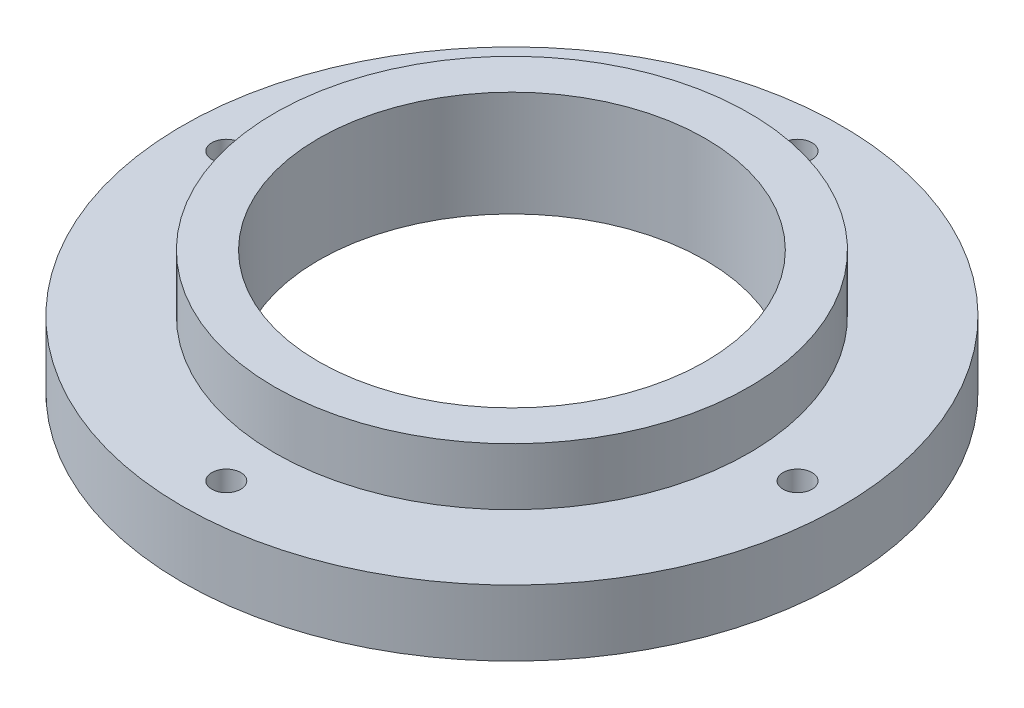
ISO-10303-21;
HEADER;
FILE_DESCRIPTION(('STEP AP214'),'2;1');
FILE_NAME('part.step','',(''),(''),'','','');
FILE_SCHEMA(('AUTOMOTIVE_DESIGN { 1 0 10303 214 1 1 1 1 }'));
ENDSEC;
DATA;
#1=APPLICATION_CONTEXT('core data for automotive mechanical design processes');
#2=APPLICATION_PROTOCOL_DEFINITION('international standard','automotive_design',2000,#1);
#3=PRODUCT_CONTEXT('',#1,'mechanical');
#4=PRODUCT('Part','Part','',(#3));
#5=PRODUCT_RELATED_PRODUCT_CATEGORY('part','',(#4));
#6=PRODUCT_DEFINITION_FORMATION('','',#4);
#7=PRODUCT_DEFINITION_CONTEXT('part definition',#1,'design');
#8=PRODUCT_DEFINITION('design','',#6,#7);
#9=PRODUCT_DEFINITION_SHAPE('','',#8);
#10=(LENGTH_UNIT() NAMED_UNIT(*) SI_UNIT(.MILLI.,.METRE.));
#11=(NAMED_UNIT(*) PLANE_ANGLE_UNIT() SI_UNIT($,.RADIAN.));
#12=(NAMED_UNIT(*) SI_UNIT($,.STERADIAN.) SOLID_ANGLE_UNIT());
#13=UNCERTAINTY_MEASURE_WITH_UNIT(LENGTH_MEASURE(1.E-05),#10,'distance_accuracy_value','');
#14=(GEOMETRIC_REPRESENTATION_CONTEXT(3) GLOBAL_UNCERTAINTY_ASSIGNED_CONTEXT((#13)) GLOBAL_UNIT_ASSIGNED_CONTEXT((#10,
#11,#12)) REPRESENTATION_CONTEXT('',''));
#15=CARTESIAN_POINT('',(0.,0.,0.));
#16=DIRECTION('',(0.,0.,1.));
#17=DIRECTION('',(1.,0.,0.));
#18=AXIS2_PLACEMENT_3D('',#15,#16,#17);
#19=CARTESIAN_POINT('',(0.,14.,0.));
#20=DIRECTION('',(0.,-1.,0.));
#21=DIRECTION('',(0.,0.,-1.));
#22=AXIS2_PLACEMENT_3D('',#19,#20,#21);
#23=CYLINDRICAL_SURFACE('',#22,22.);
#24=CARTESIAN_POINT('',(0.,14.,0.));
#25=DIRECTION('',(0.,1.,0.));
#26=DIRECTION('',(0.,0.,1.));
#27=AXIS2_PLACEMENT_3D('',#24,#25,#26);
#28=CIRCLE('',#27,22.);
#29=CARTESIAN_POINT('',(0.,14.,22.));
#30=VERTEX_POINT('',#29);
#31=EDGE_CURVE('E51',#30,#30,#28,.T.);
#32=ORIENTED_EDGE('',*,*,#31,.T.);
#33=EDGE_LOOP('',(#32));
#34=FACE_BOUND('',#33,.T.);
#35=CARTESIAN_POINT('',(0.,2.,0.));
#36=DIRECTION('',(0.,-1.,0.));
#37=DIRECTION('',(0.,0.,-1.));
#38=AXIS2_PLACEMENT_3D('',#35,#36,#37);
#39=CIRCLE('',#38,22.);
#40=CARTESIAN_POINT('',(0.,2.,-22.));
#41=VERTEX_POINT('',#40);
#42=EDGE_CURVE('E47',#41,#41,#39,.T.);
#43=ORIENTED_EDGE('',*,*,#42,.T.);
#44=EDGE_LOOP('',(#43));
#45=FACE_BOUND('',#44,.T.);
#46=ADVANCED_FACE('F43',(#34,#45),#23,.F.);
#47=CARTESIAN_POINT('',(0.,14.,0.));
#48=DIRECTION('',(0.,1.,0.));
#49=DIRECTION('',(0.,0.,1.));
#50=AXIS2_PLACEMENT_3D('',#47,#48,#49);
#51=PLANE('',#50);
#52=ORIENTED_EDGE('',*,*,#31,.F.);
#53=EDGE_LOOP('',(#52));
#54=FACE_BOUND('',#53,.T.);
#55=CARTESIAN_POINT('',(0.,14.,0.));
#56=DIRECTION('',(0.,1.,0.));
#57=DIRECTION('',(0.,0.,1.));
#58=AXIS2_PLACEMENT_3D('',#55,#56,#57);
#59=CIRCLE('',#58,27.);
#60=CARTESIAN_POINT('',(0.,14.,27.));
#61=VERTEX_POINT('',#60);
#62=EDGE_CURVE('E61',#61,#61,#59,.T.);
#63=ORIENTED_EDGE('',*,*,#62,.T.);
#64=EDGE_LOOP('',(#63));
#65=FACE_BOUND('',#64,.T.);
#66=ADVANCED_FACE('F112',(#54,#65),#51,.T.);
#67=CARTESIAN_POINT('',(0.,14.,0.));
#68=DIRECTION('',(0.,-1.,0.));
#69=DIRECTION('',(0.,0.,-1.));
#70=AXIS2_PLACEMENT_3D('',#67,#68,#69);
#71=CYLINDRICAL_SURFACE('',#70,37.5);
#72=CARTESIAN_POINT('',(0.,0.,0.));
#73=DIRECTION('',(0.,1.,0.));
#74=DIRECTION('',(0.,0.,1.));
#75=AXIS2_PLACEMENT_3D('',#72,#73,#74);
#76=CIRCLE('',#75,37.5);
#77=CARTESIAN_POINT('',(0.,0.,37.5));
#78=VERTEX_POINT('',#77);
#79=EDGE_CURVE('E10',#78,#78,#76,.T.);
#80=ORIENTED_EDGE('',*,*,#79,.T.);
#81=EDGE_LOOP('',(#80));
#82=FACE_BOUND('',#81,.T.);
#83=CARTESIAN_POINT('',(0.,7.5,0.));
#84=DIRECTION('',(0.,1.,0.));
#85=DIRECTION('',(0.,0.,1.));
#86=AXIS2_PLACEMENT_3D('',#83,#84,#85);
#87=CIRCLE('',#86,37.5);
#88=CARTESIAN_POINT('',(0.,7.5,37.5));
#89=VERTEX_POINT('',#88);
#90=EDGE_CURVE('E55',#89,#89,#87,.T.);
#91=ORIENTED_EDGE('',*,*,#90,.F.);
#92=EDGE_LOOP('',(#91));
#93=FACE_BOUND('',#92,.T.);
#94=ADVANCED_FACE('F45',(#82,#93),#71,.T.);
#95=CARTESIAN_POINT('',(0.,0.,0.));
#96=DIRECTION('',(0.,1.,0.));
#97=DIRECTION('',(0.,0.,1.));
#98=AXIS2_PLACEMENT_3D('',#95,#96,#97);
#99=PLANE('',#98);
#100=CARTESIAN_POINT('',(0.,0.,0.));
#101=DIRECTION('',(0.,-1.,0.));
#102=DIRECTION('',(0.,0.,-1.));
#103=AXIS2_PLACEMENT_3D('',#100,#101,#102);
#104=CIRCLE('',#103,26.5);
#105=CARTESIAN_POINT('',(0.,0.,-26.5));
#106=VERTEX_POINT('',#105);
#107=EDGE_CURVE('E90',#106,#106,#104,.T.);
#108=ORIENTED_EDGE('',*,*,#107,.F.);
#109=EDGE_LOOP('',(#108));
#110=FACE_BOUND('',#109,.T.);
#111=CARTESIAN_POINT('',(-32.5,0.,0.));
#112=DIRECTION('',(0.,1.,0.));
#113=DIRECTION('',(0.,0.,1.));
#114=AXIS2_PLACEMENT_3D('',#111,#112,#113);
#115=CIRCLE('',#114,1.64999999999999);
#116=CARTESIAN_POINT('',(-32.5,0.,1.64999999999999));
#117=VERTEX_POINT('',#116);
#118=EDGE_CURVE('E84',#117,#117,#115,.T.);
#119=ORIENTED_EDGE('',*,*,#118,.T.);
#120=EDGE_LOOP('',(#119));
#121=FACE_BOUND('',#120,.T.);
#122=CARTESIAN_POINT('',(0.,0.,-32.5));
#123=DIRECTION('',(0.,1.,0.));
#124=DIRECTION('',(0.,0.,1.));
#125=AXIS2_PLACEMENT_3D('',#122,#123,#124);
#126=CIRCLE('',#125,1.64999999999999);
#127=CARTESIAN_POINT('',(0.,0.,-30.85));
#128=VERTEX_POINT('',#127);
#129=EDGE_CURVE('E78',#128,#128,#126,.T.);
#130=ORIENTED_EDGE('',*,*,#129,.T.);
#131=EDGE_LOOP('',(#130));
#132=FACE_BOUND('',#131,.T.);
#133=CARTESIAN_POINT('',(0.,0.,32.5));
#134=DIRECTION('',(0.,1.,0.));
#135=DIRECTION('',(0.,0.,1.));
#136=AXIS2_PLACEMENT_3D('',#133,#134,#135);
#137=CIRCLE('',#136,1.64999999999999);
#138=CARTESIAN_POINT('',(0.,0.,34.15));
#139=VERTEX_POINT('',#138);
#140=EDGE_CURVE('E72',#139,#139,#137,.T.);
#141=ORIENTED_EDGE('',*,*,#140,.T.);
#142=EDGE_LOOP('',(#141));
#143=FACE_BOUND('',#142,.T.);
#144=CARTESIAN_POINT('',(32.5,0.,0.));
#145=DIRECTION('',(0.,1.,0.));
#146=DIRECTION('',(0.,0.,1.));
#147=AXIS2_PLACEMENT_3D('',#144,#145,#146);
#148=CIRCLE('',#147,1.64999999999999);
#149=CARTESIAN_POINT('',(32.5,0.,1.64999999999999));
#150=VERTEX_POINT('',#149);
#151=EDGE_CURVE('E64',#150,#150,#148,.T.);
#152=ORIENTED_EDGE('',*,*,#151,.T.);
#153=EDGE_LOOP('',(#152));
#154=FACE_BOUND('',#153,.T.);
#155=ORIENTED_EDGE('',*,*,#79,.F.);
#156=EDGE_LOOP('',(#155));
#157=FACE_BOUND('',#156,.T.);
#158=ADVANCED_FACE('F125',(#110,#121,#132,#143,#154,#157),#99,.F.);
#159=CARTESIAN_POINT('',(0.,7.5,0.));
#160=DIRECTION('',(0.,1.,0.));
#161=DIRECTION('',(0.,0.,1.));
#162=AXIS2_PLACEMENT_3D('',#159,#160,#161);
#163=PLANE('',#162);
#164=CARTESIAN_POINT('',(-32.5,7.5,0.));
#165=DIRECTION('',(0.,1.,0.));
#166=DIRECTION('',(0.,0.,1.));
#167=AXIS2_PLACEMENT_3D('',#164,#165,#166);
#168=CIRCLE('',#167,1.64999999999999);
#169=CARTESIAN_POINT('',(-32.5,7.5,1.64999999999999));
#170=VERTEX_POINT('',#169);
#171=EDGE_CURVE('E87',#170,#170,#168,.T.);
#172=ORIENTED_EDGE('',*,*,#171,.F.);
#173=EDGE_LOOP('',(#172));
#174=FACE_BOUND('',#173,.T.);
#175=CARTESIAN_POINT('',(0.,7.5,-32.5));
#176=DIRECTION('',(0.,1.,0.));
#177=DIRECTION('',(0.,0.,1.));
#178=AXIS2_PLACEMENT_3D('',#175,#176,#177);
#179=CIRCLE('',#178,1.64999999999999);
#180=CARTESIAN_POINT('',(0.,7.5,-30.85));
#181=VERTEX_POINT('',#180);
#182=EDGE_CURVE('E81',#181,#181,#179,.T.);
#183=ORIENTED_EDGE('',*,*,#182,.F.);
#184=EDGE_LOOP('',(#183));
#185=FACE_BOUND('',#184,.T.);
#186=CARTESIAN_POINT('',(0.,7.5,32.5));
#187=DIRECTION('',(0.,1.,0.));
#188=DIRECTION('',(0.,0.,1.));
#189=AXIS2_PLACEMENT_3D('',#186,#187,#188);
#190=CIRCLE('',#189,1.64999999999999);
#191=CARTESIAN_POINT('',(0.,7.5,34.15));
#192=VERTEX_POINT('',#191);
#193=EDGE_CURVE('E75',#192,#192,#190,.T.);
#194=ORIENTED_EDGE('',*,*,#193,.F.);
#195=EDGE_LOOP('',(#194));
#196=FACE_BOUND('',#195,.T.);
#197=CARTESIAN_POINT('',(32.5,7.5,0.));
#198=DIRECTION('',(0.,1.,0.));
#199=DIRECTION('',(0.,0.,1.));
#200=AXIS2_PLACEMENT_3D('',#197,#198,#199);
#201=CIRCLE('',#200,1.64999999999998);
#202=CARTESIAN_POINT('',(32.5,7.5,1.64999999999998));
#203=VERTEX_POINT('',#202);
#204=EDGE_CURVE('E69',#203,#203,#201,.T.);
#205=ORIENTED_EDGE('',*,*,#204,.F.);
#206=EDGE_LOOP('',(#205));
#207=FACE_BOUND('',#206,.T.);
#208=CARTESIAN_POINT('',(0.,7.5,0.));
#209=DIRECTION('',(0.,1.,0.));
#210=DIRECTION('',(0.,0.,1.));
#211=AXIS2_PLACEMENT_3D('',#208,#209,#210);
#212=CIRCLE('',#211,27.);
#213=CARTESIAN_POINT('',(0.,7.5,27.));
#214=VERTEX_POINT('',#213);
#215=EDGE_CURVE('E60',#214,#214,#212,.T.);
#216=ORIENTED_EDGE('',*,*,#215,.F.);
#217=EDGE_LOOP('',(#216));
#218=FACE_BOUND('',#217,.T.);
#219=ORIENTED_EDGE('',*,*,#90,.T.);
#220=EDGE_LOOP('',(#219));
#221=FACE_BOUND('',#220,.T.);
#222=ADVANCED_FACE('F123',(#174,#185,#196,#207,#218,#221),#163,.T.);
#223=CARTESIAN_POINT('',(0.,7.5,0.));
#224=DIRECTION('',(0.,1.,0.));
#225=DIRECTION('',(0.,0.,1.));
#226=AXIS2_PLACEMENT_3D('',#223,#224,#225);
#227=CYLINDRICAL_SURFACE('',#226,27.);
#228=CARTESIAN_POINT('',(0.,7.5,27.));
#229=CARTESIAN_POINT('',(0.,7.56770833333333,27.));
#230=CARTESIAN_POINT('',(0.,7.63541666666667,27.));
#231=CARTESIAN_POINT('',(0.,7.77083333333333,27.));
#232=CARTESIAN_POINT('',(0.,7.83854166666667,27.));
#233=CARTESIAN_POINT('',(0.,7.97395833333333,27.));
#234=CARTESIAN_POINT('',(0.,8.04166666666667,27.));
#235=CARTESIAN_POINT('',(0.,8.17708333333333,27.));
#236=CARTESIAN_POINT('',(0.,8.24479166666667,27.));
#237=CARTESIAN_POINT('',(0.,8.38020833333333,27.));
#238=CARTESIAN_POINT('',(0.,8.44791666666667,27.));
#239=CARTESIAN_POINT('',(0.,8.58333333333333,27.));
#240=CARTESIAN_POINT('',(0.,8.65104166666667,27.));
#241=CARTESIAN_POINT('',(0.,8.78645833333333,27.));
#242=CARTESIAN_POINT('',(0.,8.85416666666667,27.));
#243=CARTESIAN_POINT('',(0.,8.98958333333333,27.));
#244=CARTESIAN_POINT('',(0.,9.05729166666667,27.));
#245=CARTESIAN_POINT('',(0.,9.19270833333333,27.));
#246=CARTESIAN_POINT('',(0.,9.26041666666667,27.));
#247=CARTESIAN_POINT('',(0.,9.39583333333333,27.));
#248=CARTESIAN_POINT('',(0.,9.46354166666667,27.));
#249=CARTESIAN_POINT('',(0.,9.59895833333333,27.));
#250=CARTESIAN_POINT('',(0.,9.66666666666667,27.));
#251=CARTESIAN_POINT('',(0.,9.80208333333333,27.));
#252=CARTESIAN_POINT('',(0.,9.86979166666667,27.));
#253=CARTESIAN_POINT('',(0.,10.0052083333333,27.));
#254=CARTESIAN_POINT('',(0.,10.0729166666667,27.));
#255=CARTESIAN_POINT('',(0.,10.2083333333333,27.));
#256=CARTESIAN_POINT('',(0.,10.2760416666667,27.));
#257=CARTESIAN_POINT('',(0.,10.4114583333333,27.));
#258=CARTESIAN_POINT('',(0.,10.4791666666667,27.));
#259=CARTESIAN_POINT('',(0.,10.6145833333333,27.));
#260=CARTESIAN_POINT('',(0.,10.6822916666667,27.));
#261=CARTESIAN_POINT('',(0.,10.8177083333333,27.));
#262=CARTESIAN_POINT('',(0.,10.8854166666667,27.));
#263=CARTESIAN_POINT('',(0.,11.0208333333333,27.));
#264=CARTESIAN_POINT('',(0.,11.0885416666667,27.));
#265=CARTESIAN_POINT('',(0.,11.2239583333333,27.));
#266=CARTESIAN_POINT('',(0.,11.2916666666667,27.));
#267=CARTESIAN_POINT('',(0.,11.4270833333333,27.));
#268=CARTESIAN_POINT('',(0.,11.4947916666667,27.));
#269=CARTESIAN_POINT('',(0.,11.6302083333333,27.));
#270=CARTESIAN_POINT('',(0.,11.6979166666667,27.));
#271=CARTESIAN_POINT('',(0.,11.8333333333333,27.));
#272=CARTESIAN_POINT('',(0.,11.9010416666667,27.));
#273=CARTESIAN_POINT('',(0.,12.0364583333333,27.));
#274=CARTESIAN_POINT('',(0.,12.1041666666667,27.));
#275=CARTESIAN_POINT('',(0.,12.2395833333333,27.));
#276=CARTESIAN_POINT('',(0.,12.3072916666667,27.));
#277=CARTESIAN_POINT('',(0.,12.4427083333333,27.));
#278=CARTESIAN_POINT('',(0.,12.5104166666667,27.));
#279=CARTESIAN_POINT('',(0.,12.6458333333333,27.));
#280=CARTESIAN_POINT('',(0.,12.7135416666667,27.));
#281=CARTESIAN_POINT('',(0.,12.8489583333333,27.));
#282=CARTESIAN_POINT('',(0.,12.9166666666667,27.));
#283=CARTESIAN_POINT('',(0.,13.0520833333333,27.));
#284=CARTESIAN_POINT('',(0.,13.1197916666667,27.));
#285=CARTESIAN_POINT('',(0.,13.2552083333333,27.));
#286=CARTESIAN_POINT('',(0.,13.3229166666667,27.));
#287=CARTESIAN_POINT('',(0.,13.4583333333333,27.));
#288=CARTESIAN_POINT('',(0.,13.5260416666667,27.));
#289=CARTESIAN_POINT('',(0.,13.6614583333333,27.));
#290=CARTESIAN_POINT('',(0.,13.7291666666667,27.));
#291=CARTESIAN_POINT('',(0.,13.8645833333333,27.));
#292=CARTESIAN_POINT('',(0.,13.9322916666667,27.));
#293=CARTESIAN_POINT('',(0.,14.,27.));
#294=B_SPLINE_CURVE_WITH_KNOTS('',3,(#228,#229,#230,#231,#232,#233,#234,#235,#236,#237,#238,
#239,#240,#241,#242,#243,#244,#245,#246,#247,#248,#249,#250,#251,#252,#253,#254,#255,#256,#257,
#258,#259,#260,#261,#262,#263,#264,#265,#266,#267,#268,#269,#270,#271,#272,#273,#274,#275,#276,
#277,#278,#279,#280,#281,#282,#283,#284,#285,#286,#287,#288,#289,#290,#291,#292,#293),
.UNSPECIFIED.,.F.,.F.,(4,2,2,2,2,2,2,2,2,2,2,2,2,2,2,2,2,2,2,2,2,2,2,2,2,2,2,2,2,2,2,2,4),(0.,
0.203125,0.40625,0.609375000000001,0.812500000000001,1.015625,1.21875,1.421875,1.625,1.828125,
2.03125,2.234375,2.4375,2.640625,2.84375,3.046875,3.25,3.453125,3.65625,3.859375,4.0625,
4.265625,4.46875,4.671875,4.875,5.078125,5.28125,5.484375,5.6875,5.890625,6.09375,6.296875,6.5),.UNSPECIFIED.);
#295=EDGE_CURVE('BSEAM130',#214,#61,#294,.T.);
#296=ORIENTED_EDGE('',*,*,#215,.T.);
#297=ORIENTED_EDGE('',*,*,#62,.F.);
#298=ORIENTED_EDGE('',*,*,#295,.T.);
#299=ORIENTED_EDGE('',*,*,#295,.F.);
#300=EDGE_LOOP('',(#296,#298,#297,#299));
#301=FACE_BOUND('',#300,.T.);
#302=ADVANCED_FACE('F130',(#301),#227,.T.);
#303=CARTESIAN_POINT('',(32.5,7.5,0.));
#304=DIRECTION('',(0.,1.,0.));
#305=DIRECTION('',(0.,0.,1.));
#306=AXIS2_PLACEMENT_3D('',#303,#304,#305);
#307=CYLINDRICAL_SURFACE('',#306,1.64999999999999);
#308=ORIENTED_EDGE('',*,*,#151,.F.);
#309=EDGE_LOOP('',(#308));
#310=FACE_BOUND('',#309,.T.);
#311=ORIENTED_EDGE('',*,*,#204,.T.);
#312=EDGE_LOOP('',(#311));
#313=FACE_BOUND('',#312,.T.);
#314=ADVANCED_FACE('F144',(#310,#313),#307,.F.);
#315=CARTESIAN_POINT('',(0.,7.5,32.5));
#316=DIRECTION('',(0.,1.,0.));
#317=DIRECTION('',(0.,0.,1.));
#318=AXIS2_PLACEMENT_3D('',#315,#316,#317);
#319=CYLINDRICAL_SURFACE('',#318,1.64999999999999);
#320=ORIENTED_EDGE('',*,*,#140,.F.);
#321=EDGE_LOOP('',(#320));
#322=FACE_BOUND('',#321,.T.);
#323=ORIENTED_EDGE('',*,*,#193,.T.);
#324=EDGE_LOOP('',(#323));
#325=FACE_BOUND('',#324,.T.);
#326=ADVANCED_FACE('F147',(#322,#325),#319,.F.);
#327=CARTESIAN_POINT('',(0.,7.5,-32.5));
#328=DIRECTION('',(0.,1.,0.));
#329=DIRECTION('',(0.,0.,1.));
#330=AXIS2_PLACEMENT_3D('',#327,#328,#329);
#331=CYLINDRICAL_SURFACE('',#330,1.64999999999999);
#332=ORIENTED_EDGE('',*,*,#129,.F.);
#333=EDGE_LOOP('',(#332));
#334=FACE_BOUND('',#333,.T.);
#335=ORIENTED_EDGE('',*,*,#182,.T.);
#336=EDGE_LOOP('',(#335));
#337=FACE_BOUND('',#336,.T.);
#338=ADVANCED_FACE('F167',(#334,#337),#331,.F.);
#339=CARTESIAN_POINT('',(-32.5,7.5,0.));
#340=DIRECTION('',(0.,1.,0.));
#341=DIRECTION('',(0.,0.,1.));
#342=AXIS2_PLACEMENT_3D('',#339,#340,#341);
#343=CYLINDRICAL_SURFACE('',#342,1.64999999999999);
#344=ORIENTED_EDGE('',*,*,#118,.F.);
#345=EDGE_LOOP('',(#344));
#346=FACE_BOUND('',#345,.T.);
#347=ORIENTED_EDGE('',*,*,#171,.T.);
#348=EDGE_LOOP('',(#347));
#349=FACE_BOUND('',#348,.T.);
#350=ADVANCED_FACE('F108',(#346,#349),#343,.F.);
#351=CARTESIAN_POINT('',(0.,2.,0.));
#352=DIRECTION('',(0.,-1.,0.));
#353=DIRECTION('',(0.,0.,-1.));
#354=AXIS2_PLACEMENT_3D('',#351,#352,#353);
#355=CYLINDRICAL_SURFACE('',#354,26.5);
#356=CARTESIAN_POINT('',(0.,2.,0.));
#357=DIRECTION('',(0.,-1.,0.));
#358=DIRECTION('',(0.,0.,-1.));
#359=AXIS2_PLACEMENT_3D('',#356,#357,#358);
#360=CIRCLE('',#359,26.5);
#361=CARTESIAN_POINT('',(0.,2.,-26.5));
#362=VERTEX_POINT('',#361);
#363=EDGE_CURVE('E93',#362,#362,#360,.T.);
#364=ORIENTED_EDGE('',*,*,#363,.F.);
#365=EDGE_LOOP('',(#364));
#366=FACE_BOUND('',#365,.T.);
#367=ORIENTED_EDGE('',*,*,#107,.T.);
#368=EDGE_LOOP('',(#367));
#369=FACE_BOUND('',#368,.T.);
#370=ADVANCED_FACE('F103',(#366,#369),#355,.F.);
#371=CARTESIAN_POINT('',(0.,2.,0.));
#372=DIRECTION('',(0.,-1.,0.));
#373=DIRECTION('',(0.,0.,-1.));
#374=AXIS2_PLACEMENT_3D('',#371,#372,#373);
#375=PLANE('',#374);
#376=ORIENTED_EDGE('',*,*,#42,.F.);
#377=EDGE_LOOP('',(#376));
#378=FACE_BOUND('',#377,.T.);
#379=ORIENTED_EDGE('',*,*,#363,.T.);
#380=EDGE_LOOP('',(#379));
#381=FACE_BOUND('',#380,.T.);
#382=ADVANCED_FACE('F101',(#378,#381),#375,.T.);
#383=CLOSED_SHELL('',(#46,#66,#94,#158,#222,#302,#314,#326,#338,#350,#370,#382));
#384=MANIFOLD_SOLID_BREP('B2',#383);
#385=ADVANCED_BREP_SHAPE_REPRESENTATION('',(#18,#384),#14);
#386=SHAPE_DEFINITION_REPRESENTATION(#9,#385);
ENDSEC;
END-ISO-10303-21;
